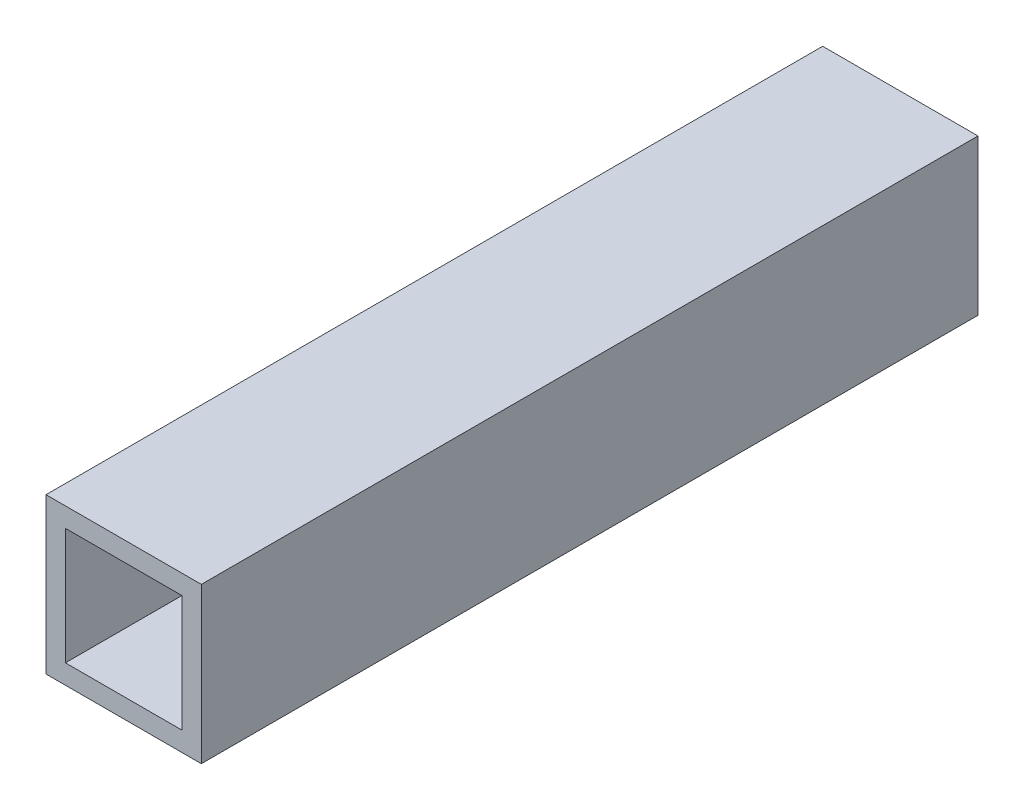
ISO-10303-21;
HEADER;
FILE_DESCRIPTION(('STEP AP214'),'2;1');
FILE_NAME('part.step','',(''),(''),'','','');
FILE_SCHEMA(('AUTOMOTIVE_DESIGN { 1 0 10303 214 1 1 1 1 }'));
ENDSEC;
DATA;
#1=APPLICATION_CONTEXT('core data for automotive mechanical design processes');
#2=APPLICATION_PROTOCOL_DEFINITION('international standard','automotive_design',2000,#1);
#3=PRODUCT_CONTEXT('',#1,'mechanical');
#4=PRODUCT('Part','Part','',(#3));
#5=PRODUCT_RELATED_PRODUCT_CATEGORY('part','',(#4));
#6=PRODUCT_DEFINITION_FORMATION('','',#4);
#7=PRODUCT_DEFINITION_CONTEXT('part definition',#1,'design');
#8=PRODUCT_DEFINITION('design','',#6,#7);
#9=PRODUCT_DEFINITION_SHAPE('','',#8);
#10=(LENGTH_UNIT() NAMED_UNIT(*) SI_UNIT(.MILLI.,.METRE.));
#11=(NAMED_UNIT(*) PLANE_ANGLE_UNIT() SI_UNIT($,.RADIAN.));
#12=(NAMED_UNIT(*) SI_UNIT($,.STERADIAN.) SOLID_ANGLE_UNIT());
#13=UNCERTAINTY_MEASURE_WITH_UNIT(LENGTH_MEASURE(1.E-05),#10,'distance_accuracy_value','');
#14=(GEOMETRIC_REPRESENTATION_CONTEXT(3) GLOBAL_UNCERTAINTY_ASSIGNED_CONTEXT((#13)) GLOBAL_UNIT_ASSIGNED_CONTEXT((#10,
#11,#12)) REPRESENTATION_CONTEXT('',''));
#15=CARTESIAN_POINT('',(0.,0.,0.));
#16=DIRECTION('',(0.,0.,1.));
#17=DIRECTION('',(1.,0.,0.));
#18=AXIS2_PLACEMENT_3D('',#15,#16,#17);
#19=CARTESIAN_POINT('',(0.,0.,127.));
#20=DIRECTION('',(-1.,0.,0.));
#21=DIRECTION('',(0.,-1.,0.));
#22=AXIS2_PLACEMENT_3D('',#19,#20,#21);
#23=PLANE('',#22);
#24=DIRECTION('',(0.,1.,0.));
#25=VECTOR('',#24,1.);
#26=CARTESIAN_POINT('',(0.,0.,0.));
#27=LINE('',#26,#25);
#28=CARTESIAN_POINT('',(0.,0.,0.));
#29=VERTEX_POINT('',#28);
#30=CARTESIAN_POINT('',(0.,25.4,0.));
#31=VERTEX_POINT('',#30);
#32=EDGE_CURVE('E147',#29,#31,#27,.T.);
#33=ORIENTED_EDGE('',*,*,#32,.T.);
#34=DIRECTION('',(0.,0.,-1.));
#35=VECTOR('',#34,1.);
#36=CARTESIAN_POINT('',(0.,25.4,127.));
#37=LINE('',#36,#35);
#38=CARTESIAN_POINT('',(0.,25.4,127.));
#39=VERTEX_POINT('',#38);
#40=EDGE_CURVE('E11',#39,#31,#37,.T.);
#41=ORIENTED_EDGE('',*,*,#40,.F.);
#42=DIRECTION('',(0.,1.,0.));
#43=VECTOR('',#42,1.);
#44=CARTESIAN_POINT('',(0.,0.,127.));
#45=LINE('',#44,#43);
#46=CARTESIAN_POINT('',(0.,0.,127.));
#47=VERTEX_POINT('',#46);
#48=EDGE_CURVE('E153',#47,#39,#45,.T.);
#49=ORIENTED_EDGE('',*,*,#48,.F.);
#50=DIRECTION('',(0.,0.,-1.));
#51=VECTOR('',#50,1.);
#52=CARTESIAN_POINT('',(0.,0.,127.));
#53=LINE('',#52,#51);
#54=EDGE_CURVE('E167',#47,#29,#53,.T.);
#55=ORIENTED_EDGE('',*,*,#54,.T.);
#56=EDGE_LOOP('',(#33,#41,#49,#55));
#57=FACE_BOUND('',#56,.T.);
#58=ADVANCED_FACE('F39',(#57),#23,.F.);
#59=CARTESIAN_POINT('',(0.,25.4,127.));
#60=DIRECTION('',(0.,-1.,0.));
#61=DIRECTION('',(1.,0.,0.));
#62=AXIS2_PLACEMENT_3D('',#59,#60,#61);
#63=PLANE('',#62);
#64=DIRECTION('',(-1.,0.,0.));
#65=VECTOR('',#64,1.);
#66=CARTESIAN_POINT('',(0.,25.4,0.));
#67=LINE('',#66,#65);
#68=CARTESIAN_POINT('',(-25.4,25.4,0.));
#69=VERTEX_POINT('',#68);
#70=EDGE_CURVE('E171',#31,#69,#67,.T.);
#71=ORIENTED_EDGE('',*,*,#70,.T.);
#72=DIRECTION('',(0.,0.,-1.));
#73=VECTOR('',#72,1.);
#74=CARTESIAN_POINT('',(-25.4,25.4,127.));
#75=LINE('',#74,#73);
#76=CARTESIAN_POINT('',(-25.4,25.4,127.));
#77=VERTEX_POINT('',#76);
#78=EDGE_CURVE('E47',#77,#69,#75,.T.);
#79=ORIENTED_EDGE('',*,*,#78,.F.);
#80=DIRECTION('',(-1.,0.,0.));
#81=VECTOR('',#80,1.);
#82=CARTESIAN_POINT('',(0.,25.4,127.));
#83=LINE('',#82,#81);
#84=EDGE_CURVE('E157',#39,#77,#83,.T.);
#85=ORIENTED_EDGE('',*,*,#84,.F.);
#86=ORIENTED_EDGE('',*,*,#40,.T.);
#87=EDGE_LOOP('',(#71,#79,#85,#86));
#88=FACE_BOUND('',#87,.T.);
#89=ADVANCED_FACE('F205',(#88),#63,.F.);
#90=CARTESIAN_POINT('',(-25.4,0.,127.));
#91=DIRECTION('',(1.,0.,0.));
#92=DIRECTION('',(0.,0.,-1.));
#93=AXIS2_PLACEMENT_3D('',#90,#91,#92);
#94=PLANE('',#93);
#95=DIRECTION('',(0.,-1.,0.));
#96=VECTOR('',#95,1.);
#97=CARTESIAN_POINT('',(-25.4,0.,0.));
#98=LINE('',#97,#96);
#99=CARTESIAN_POINT('',(-25.4,0.,0.));
#100=VERTEX_POINT('',#99);
#101=EDGE_CURVE('E174',#69,#100,#98,.T.);
#102=ORIENTED_EDGE('',*,*,#101,.T.);
#103=DIRECTION('',(0.,0.,-1.));
#104=VECTOR('',#103,1.);
#105=CARTESIAN_POINT('',(-25.4,0.,127.));
#106=LINE('',#105,#104);
#107=CARTESIAN_POINT('',(-25.4,0.,127.));
#108=VERTEX_POINT('',#107);
#109=EDGE_CURVE('E182',#108,#100,#106,.T.);
#110=ORIENTED_EDGE('',*,*,#109,.F.);
#111=DIRECTION('',(0.,-1.,0.));
#112=VECTOR('',#111,1.);
#113=CARTESIAN_POINT('',(-25.4,0.,127.));
#114=LINE('',#113,#112);
#115=EDGE_CURVE('E161',#77,#108,#114,.T.);
#116=ORIENTED_EDGE('',*,*,#115,.F.);
#117=ORIENTED_EDGE('',*,*,#78,.T.);
#118=EDGE_LOOP('',(#102,#110,#116,#117));
#119=FACE_BOUND('',#118,.T.);
#120=ADVANCED_FACE('F191',(#119),#94,.F.);
#121=CARTESIAN_POINT('',(0.,0.,127.));
#122=DIRECTION('',(0.,1.,0.));
#123=DIRECTION('',(-1.,0.,0.));
#124=AXIS2_PLACEMENT_3D('',#121,#122,#123);
#125=PLANE('',#124);
#126=DIRECTION('',(1.,0.,0.));
#127=VECTOR('',#126,1.);
#128=CARTESIAN_POINT('',(0.,0.,0.));
#129=LINE('',#128,#127);
#130=EDGE_CURVE('E158',#100,#29,#129,.T.);
#131=ORIENTED_EDGE('',*,*,#130,.T.);
#132=ORIENTED_EDGE('',*,*,#54,.F.);
#133=DIRECTION('',(1.,0.,0.));
#134=VECTOR('',#133,1.);
#135=CARTESIAN_POINT('',(0.,0.,127.));
#136=LINE('',#135,#134);
#137=EDGE_CURVE('E164',#108,#47,#136,.T.);
#138=ORIENTED_EDGE('',*,*,#137,.F.);
#139=ORIENTED_EDGE('',*,*,#109,.T.);
#140=EDGE_LOOP('',(#131,#132,#138,#139));
#141=FACE_BOUND('',#140,.T.);
#142=ADVANCED_FACE('F198',(#141),#125,.F.);
#143=CARTESIAN_POINT('',(0.,0.,127.));
#144=DIRECTION('',(0.,0.,1.));
#145=DIRECTION('',(1.,0.,0.));
#146=AXIS2_PLACEMENT_3D('',#143,#144,#145);
#147=PLANE('',#146);
#148=DIRECTION('',(0.,-1.,0.));
#149=VECTOR('',#148,1.);
#150=CARTESIAN_POINT('',(-22.225,22.225,127.));
#151=LINE('',#150,#149);
#152=CARTESIAN_POINT('',(-22.225,22.225,127.));
#153=VERTEX_POINT('',#152);
#154=CARTESIAN_POINT('',(-22.225,3.175,127.));
#155=VERTEX_POINT('',#154);
#156=EDGE_CURVE('E54',#153,#155,#151,.T.);
#157=ORIENTED_EDGE('',*,*,#156,.F.);
#158=DIRECTION('',(-1.,0.,0.));
#159=VECTOR('',#158,1.);
#160=CARTESIAN_POINT('',(-22.225,22.225,127.));
#161=LINE('',#160,#159);
#162=CARTESIAN_POINT('',(-3.175,22.225,127.));
#163=VERTEX_POINT('',#162);
#164=EDGE_CURVE('E125',#163,#153,#161,.T.);
#165=ORIENTED_EDGE('',*,*,#164,.F.);
#166=DIRECTION('',(0.,1.,0.));
#167=VECTOR('',#166,1.);
#168=CARTESIAN_POINT('',(-3.175,22.225,127.));
#169=LINE('',#168,#167);
#170=CARTESIAN_POINT('',(-3.175,3.175,127.));
#171=VERTEX_POINT('',#170);
#172=EDGE_CURVE('E129',#171,#163,#169,.T.);
#173=ORIENTED_EDGE('',*,*,#172,.F.);
#174=DIRECTION('',(1.,0.,0.));
#175=VECTOR('',#174,1.);
#176=CARTESIAN_POINT('',(-22.225,3.175,127.));
#177=LINE('',#176,#175);
#178=EDGE_CURVE('E138',#155,#171,#177,.T.);
#179=ORIENTED_EDGE('',*,*,#178,.F.);
#180=EDGE_LOOP('',(#157,#165,#173,#179));
#181=FACE_BOUND('',#180,.T.);
#182=ORIENTED_EDGE('',*,*,#48,.T.);
#183=ORIENTED_EDGE('',*,*,#84,.T.);
#184=ORIENTED_EDGE('',*,*,#115,.T.);
#185=ORIENTED_EDGE('',*,*,#137,.T.);
#186=EDGE_LOOP('',(#182,#183,#184,#185));
#187=FACE_BOUND('',#186,.T.);
#188=ADVANCED_FACE('F204',(#181,#187),#147,.T.);
#189=CARTESIAN_POINT('',(0.,0.,0.));
#190=DIRECTION('',(0.,0.,1.));
#191=DIRECTION('',(1.,0.,0.));
#192=AXIS2_PLACEMENT_3D('',#189,#190,#191);
#193=PLANE('',#192);
#194=DIRECTION('',(-1.,0.,0.));
#195=VECTOR('',#194,1.);
#196=CARTESIAN_POINT('',(-22.225,22.225,0.));
#197=LINE('',#196,#195);
#198=CARTESIAN_POINT('',(-3.175,22.225,0.));
#199=VERTEX_POINT('',#198);
#200=CARTESIAN_POINT('',(-22.225,22.225,0.));
#201=VERTEX_POINT('',#200);
#202=EDGE_CURVE('E113',#199,#201,#197,.T.);
#203=ORIENTED_EDGE('',*,*,#202,.T.);
#204=DIRECTION('',(0.,-1.,0.));
#205=VECTOR('',#204,1.);
#206=CARTESIAN_POINT('',(-22.225,22.225,0.));
#207=LINE('',#206,#205);
#208=CARTESIAN_POINT('',(-22.225,3.175,0.));
#209=VERTEX_POINT('',#208);
#210=EDGE_CURVE('E106',#201,#209,#207,.T.);
#211=ORIENTED_EDGE('',*,*,#210,.T.);
#212=DIRECTION('',(1.,0.,0.));
#213=VECTOR('',#212,1.);
#214=CARTESIAN_POINT('',(-22.225,3.175,0.));
#215=LINE('',#214,#213);
#216=CARTESIAN_POINT('',(-3.175,3.175,0.));
#217=VERTEX_POINT('',#216);
#218=EDGE_CURVE('E116',#209,#217,#215,.T.);
#219=ORIENTED_EDGE('',*,*,#218,.T.);
#220=DIRECTION('',(0.,1.,0.));
#221=VECTOR('',#220,1.);
#222=CARTESIAN_POINT('',(-3.175,22.225,0.));
#223=LINE('',#222,#221);
#224=EDGE_CURVE('E62',#217,#199,#223,.T.);
#225=ORIENTED_EDGE('',*,*,#224,.T.);
#226=EDGE_LOOP('',(#203,#211,#219,#225));
#227=FACE_BOUND('',#226,.T.);
#228=ORIENTED_EDGE('',*,*,#32,.F.);
#229=ORIENTED_EDGE('',*,*,#130,.F.);
#230=ORIENTED_EDGE('',*,*,#101,.F.);
#231=ORIENTED_EDGE('',*,*,#70,.F.);
#232=EDGE_LOOP('',(#228,#229,#230,#231));
#233=FACE_BOUND('',#232,.T.);
#234=ADVANCED_FACE('F121',(#227,#233),#193,.F.);
#235=CARTESIAN_POINT('',(-22.225,22.225,0.));
#236=DIRECTION('',(-1.,0.,0.));
#237=DIRECTION('',(0.,-1.,0.));
#238=AXIS2_PLACEMENT_3D('',#235,#236,#237);
#239=PLANE('',#238);
#240=ORIENTED_EDGE('',*,*,#156,.T.);
#241=DIRECTION('',(0.,0.,1.));
#242=VECTOR('',#241,1.);
#243=CARTESIAN_POINT('',(-22.225,3.175,0.));
#244=LINE('',#243,#242);
#245=EDGE_CURVE('E102',#209,#155,#244,.T.);
#246=ORIENTED_EDGE('',*,*,#245,.F.);
#247=ORIENTED_EDGE('',*,*,#210,.F.);
#248=DIRECTION('',(0.,0.,1.));
#249=VECTOR('',#248,1.);
#250=CARTESIAN_POINT('',(-22.225,22.225,0.));
#251=LINE('',#250,#249);
#252=EDGE_CURVE('E144',#201,#153,#251,.T.);
#253=ORIENTED_EDGE('',*,*,#252,.T.);
#254=EDGE_LOOP('',(#240,#246,#247,#253));
#255=FACE_BOUND('',#254,.T.);
#256=ADVANCED_FACE('F104',(#255),#239,.F.);
#257=CARTESIAN_POINT('',(-22.225,22.225,0.));
#258=DIRECTION('',(0.,1.,0.));
#259=DIRECTION('',(0.,0.,1.));
#260=AXIS2_PLACEMENT_3D('',#257,#258,#259);
#261=PLANE('',#260);
#262=ORIENTED_EDGE('',*,*,#164,.T.);
#263=ORIENTED_EDGE('',*,*,#252,.F.);
#264=ORIENTED_EDGE('',*,*,#202,.F.);
#265=DIRECTION('',(0.,0.,1.));
#266=VECTOR('',#265,1.);
#267=CARTESIAN_POINT('',(-3.175,22.225,0.));
#268=LINE('',#267,#266);
#269=EDGE_CURVE('E148',#199,#163,#268,.T.);
#270=ORIENTED_EDGE('',*,*,#269,.T.);
#271=EDGE_LOOP('',(#262,#263,#264,#270));
#272=FACE_BOUND('',#271,.T.);
#273=ADVANCED_FACE('F222',(#272),#261,.F.);
#274=CARTESIAN_POINT('',(-3.175,22.225,0.));
#275=DIRECTION('',(1.,0.,0.));
#276=DIRECTION('',(0.,1.,0.));
#277=AXIS2_PLACEMENT_3D('',#274,#275,#276);
#278=PLANE('',#277);
#279=ORIENTED_EDGE('',*,*,#172,.T.);
#280=ORIENTED_EDGE('',*,*,#269,.F.);
#281=ORIENTED_EDGE('',*,*,#224,.F.);
#282=DIRECTION('',(0.,0.,1.));
#283=VECTOR('',#282,1.);
#284=CARTESIAN_POINT('',(-3.175,3.175,0.));
#285=LINE('',#284,#283);
#286=EDGE_CURVE('E112',#217,#171,#285,.T.);
#287=ORIENTED_EDGE('',*,*,#286,.T.);
#288=EDGE_LOOP('',(#279,#280,#281,#287));
#289=FACE_BOUND('',#288,.T.);
#290=ADVANCED_FACE('F225',(#289),#278,.F.);
#291=CARTESIAN_POINT('',(-22.225,3.175,0.));
#292=DIRECTION('',(0.,-1.,0.));
#293=DIRECTION('',(0.,0.,-1.));
#294=AXIS2_PLACEMENT_3D('',#291,#292,#293);
#295=PLANE('',#294);
#296=ORIENTED_EDGE('',*,*,#178,.T.);
#297=ORIENTED_EDGE('',*,*,#286,.F.);
#298=ORIENTED_EDGE('',*,*,#218,.F.);
#299=ORIENTED_EDGE('',*,*,#245,.T.);
#300=EDGE_LOOP('',(#296,#297,#298,#299));
#301=FACE_BOUND('',#300,.T.);
#302=ADVANCED_FACE('F117',(#301),#295,.F.);
#303=CLOSED_SHELL('',(#58,#89,#120,#142,#188,#234,#256,#273,#290,#302));
#304=MANIFOLD_SOLID_BREP('B2',#303);
#305=ADVANCED_BREP_SHAPE_REPRESENTATION('',(#18,#304),#14);
#306=SHAPE_DEFINITION_REPRESENTATION(#9,#305);
ENDSEC;
END-ISO-10303-21;
